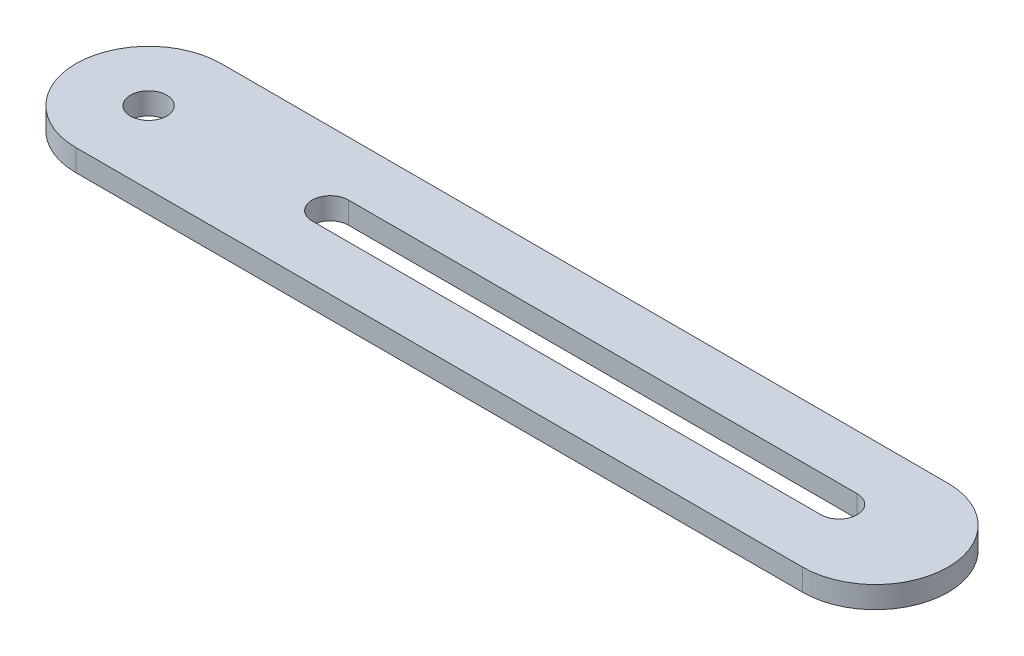
ISO-10303-21;
HEADER;
FILE_DESCRIPTION(('STEP AP214'),'2;1');
FILE_NAME('part.step','',(''),(''),'','','');
FILE_SCHEMA(('AUTOMOTIVE_DESIGN { 1 0 10303 214 1 1 1 1 }'));
ENDSEC;
DATA;
#1=APPLICATION_CONTEXT('core data for automotive mechanical design processes');
#2=APPLICATION_PROTOCOL_DEFINITION('international standard','automotive_design',2000,#1);
#3=PRODUCT_CONTEXT('',#1,'mechanical');
#4=PRODUCT('Part','Part','',(#3));
#5=PRODUCT_RELATED_PRODUCT_CATEGORY('part','',(#4));
#6=PRODUCT_DEFINITION_FORMATION('','',#4);
#7=PRODUCT_DEFINITION_CONTEXT('part definition',#1,'design');
#8=PRODUCT_DEFINITION('design','',#6,#7);
#9=PRODUCT_DEFINITION_SHAPE('','',#8);
#10=(LENGTH_UNIT() NAMED_UNIT(*) SI_UNIT(.MILLI.,.METRE.));
#11=(NAMED_UNIT(*) PLANE_ANGLE_UNIT() SI_UNIT($,.RADIAN.));
#12=(NAMED_UNIT(*) SI_UNIT($,.STERADIAN.) SOLID_ANGLE_UNIT());
#13=UNCERTAINTY_MEASURE_WITH_UNIT(LENGTH_MEASURE(1.E-05),#10,'distance_accuracy_value','');
#14=(GEOMETRIC_REPRESENTATION_CONTEXT(3) GLOBAL_UNCERTAINTY_ASSIGNED_CONTEXT((#13)) GLOBAL_UNIT_ASSIGNED_CONTEXT((#10,
#11,#12)) REPRESENTATION_CONTEXT('',''));
#15=CARTESIAN_POINT('',(0.,0.,0.));
#16=DIRECTION('',(0.,0.,1.));
#17=DIRECTION('',(1.,0.,0.));
#18=AXIS2_PLACEMENT_3D('',#15,#16,#17);
#19=CARTESIAN_POINT('',(-50.,-3.,0.));
#20=DIRECTION('',(0.,1.,0.));
#21=DIRECTION('',(0.,0.,1.));
#22=AXIS2_PLACEMENT_3D('',#19,#20,#21);
#23=CYLINDRICAL_SURFACE('',#22,10.);
#24=CARTESIAN_POINT('',(-50.,0.,0.));
#25=DIRECTION('',(0.,1.,0.));
#26=DIRECTION('',(0.,0.,1.));
#27=AXIS2_PLACEMENT_3D('',#24,#25,#26);
#28=CIRCLE('',#27,10.);
#29=CARTESIAN_POINT('',(-50.,0.,-10.));
#30=VERTEX_POINT('',#29);
#31=CARTESIAN_POINT('',(-50.,0.,10.));
#32=VERTEX_POINT('',#31);
#33=EDGE_CURVE('E138',#30,#32,#28,.T.);
#34=ORIENTED_EDGE('',*,*,#33,.F.);
#35=DIRECTION('',(0.,1.,0.));
#36=VECTOR('',#35,1.);
#37=CARTESIAN_POINT('',(-50.,-3.,-10.));
#38=LINE('',#37,#36);
#39=CARTESIAN_POINT('',(-50.,-3.,-10.));
#40=VERTEX_POINT('',#39);
#41=EDGE_CURVE('E11',#40,#30,#38,.T.);
#42=ORIENTED_EDGE('',*,*,#41,.F.);
#43=CARTESIAN_POINT('',(-50.,-3.,0.));
#44=DIRECTION('',(0.,1.,0.));
#45=DIRECTION('',(0.,0.,1.));
#46=AXIS2_PLACEMENT_3D('',#43,#44,#45);
#47=CIRCLE('',#46,10.);
#48=CARTESIAN_POINT('',(-50.,-3.,10.));
#49=VERTEX_POINT('',#48);
#50=EDGE_CURVE('E142',#40,#49,#47,.T.);
#51=ORIENTED_EDGE('',*,*,#50,.T.);
#52=DIRECTION('',(0.,1.,0.));
#53=VECTOR('',#52,1.);
#54=CARTESIAN_POINT('',(-50.,-3.,10.));
#55=LINE('',#54,#53);
#56=EDGE_CURVE('E39',#49,#32,#55,.T.);
#57=ORIENTED_EDGE('',*,*,#56,.T.);
#58=EDGE_LOOP('',(#34,#42,#51,#57));
#59=FACE_BOUND('',#58,.T.);
#60=ADVANCED_FACE('F36',(#59),#23,.T.);
#61=CARTESIAN_POINT('',(-50.,-3.,-10.));
#62=DIRECTION('',(0.,0.,-1.));
#63=DIRECTION('',(-1.,0.,0.));
#64=AXIS2_PLACEMENT_3D('',#61,#62,#63);
#65=PLANE('',#64);
#66=DIRECTION('',(-1.,0.,0.));
#67=VECTOR('',#66,1.);
#68=CARTESIAN_POINT('',(-50.,0.,-10.));
#69=LINE('',#68,#67);
#70=CARTESIAN_POINT('',(50.,0.,-10.));
#71=VERTEX_POINT('',#70);
#72=EDGE_CURVE('E146',#71,#30,#69,.T.);
#73=ORIENTED_EDGE('',*,*,#72,.F.);
#74=DIRECTION('',(0.,1.,0.));
#75=VECTOR('',#74,1.);
#76=CARTESIAN_POINT('',(50.,-3.,-10.));
#77=LINE('',#76,#75);
#78=CARTESIAN_POINT('',(50.,-3.,-10.));
#79=VERTEX_POINT('',#78);
#80=EDGE_CURVE('E44',#79,#71,#77,.T.);
#81=ORIENTED_EDGE('',*,*,#80,.F.);
#82=DIRECTION('',(-1.,0.,0.));
#83=VECTOR('',#82,1.);
#84=CARTESIAN_POINT('',(-50.,-3.,-10.));
#85=LINE('',#84,#83);
#86=EDGE_CURVE('E152',#79,#40,#85,.T.);
#87=ORIENTED_EDGE('',*,*,#86,.T.);
#88=ORIENTED_EDGE('',*,*,#41,.T.);
#89=EDGE_LOOP('',(#73,#81,#87,#88));
#90=FACE_BOUND('',#89,.T.);
#91=ADVANCED_FACE('F178',(#90),#65,.T.);
#92=CARTESIAN_POINT('',(50.,-3.,0.));
#93=DIRECTION('',(0.,1.,0.));
#94=DIRECTION('',(0.,0.,1.));
#95=AXIS2_PLACEMENT_3D('',#92,#93,#94);
#96=CYLINDRICAL_SURFACE('',#95,10.);
#97=CARTESIAN_POINT('',(50.,0.,0.));
#98=DIRECTION('',(0.,1.,0.));
#99=DIRECTION('',(0.,0.,1.));
#100=AXIS2_PLACEMENT_3D('',#97,#98,#99);
#101=CIRCLE('',#100,10.);
#102=CARTESIAN_POINT('',(50.,0.,10.));
#103=VERTEX_POINT('',#102);
#104=EDGE_CURVE('E160',#103,#71,#101,.T.);
#105=ORIENTED_EDGE('',*,*,#104,.F.);
#106=DIRECTION('',(0.,1.,0.));
#107=VECTOR('',#106,1.);
#108=CARTESIAN_POINT('',(50.,-3.,10.));
#109=LINE('',#108,#107);
#110=CARTESIAN_POINT('',(50.,-3.,10.));
#111=VERTEX_POINT('',#110);
#112=EDGE_CURVE('E165',#111,#103,#109,.T.);
#113=ORIENTED_EDGE('',*,*,#112,.F.);
#114=CARTESIAN_POINT('',(50.,-3.,0.));
#115=DIRECTION('',(0.,1.,0.));
#116=DIRECTION('',(0.,0.,1.));
#117=AXIS2_PLACEMENT_3D('',#114,#115,#116);
#118=CIRCLE('',#117,10.);
#119=EDGE_CURVE('E149',#111,#79,#118,.T.);
#120=ORIENTED_EDGE('',*,*,#119,.T.);
#121=ORIENTED_EDGE('',*,*,#80,.T.);
#122=EDGE_LOOP('',(#105,#113,#120,#121));
#123=FACE_BOUND('',#122,.T.);
#124=ADVANCED_FACE('F182',(#123),#96,.T.);
#125=CARTESIAN_POINT('',(-50.,-3.,10.));
#126=DIRECTION('',(0.,0.,1.));
#127=DIRECTION('',(1.,0.,0.));
#128=AXIS2_PLACEMENT_3D('',#125,#126,#127);
#129=PLANE('',#128);
#130=DIRECTION('',(1.,0.,0.));
#131=VECTOR('',#130,1.);
#132=CARTESIAN_POINT('',(-50.,0.,10.));
#133=LINE('',#132,#131);
#134=EDGE_CURVE('E157',#32,#103,#133,.T.);
#135=ORIENTED_EDGE('',*,*,#134,.F.);
#136=ORIENTED_EDGE('',*,*,#56,.F.);
#137=DIRECTION('',(1.,0.,0.));
#138=VECTOR('',#137,1.);
#139=CARTESIAN_POINT('',(-50.,-3.,10.));
#140=LINE('',#139,#138);
#141=EDGE_CURVE('E145',#49,#111,#140,.T.);
#142=ORIENTED_EDGE('',*,*,#141,.T.);
#143=ORIENTED_EDGE('',*,*,#112,.T.);
#144=EDGE_LOOP('',(#135,#136,#142,#143));
#145=FACE_BOUND('',#144,.T.);
#146=ADVANCED_FACE('F173',(#145),#129,.T.);
#147=CARTESIAN_POINT('',(-50.,-3.,0.));
#148=DIRECTION('',(0.,1.,0.));
#149=DIRECTION('',(0.,0.,1.));
#150=AXIS2_PLACEMENT_3D('',#147,#148,#149);
#151=PLANE('',#150);
#152=CARTESIAN_POINT('',(-50.,-3.,0.));
#153=DIRECTION('',(0.,1.,0.));
#154=DIRECTION('',(0.,0.,1.));
#155=AXIS2_PLACEMENT_3D('',#152,#153,#154);
#156=CIRCLE('',#155,2.5);
#157=CARTESIAN_POINT('',(-50.,-3.,2.5));
#158=VERTEX_POINT('',#157);
#159=EDGE_CURVE('E132',#158,#158,#156,.T.);
#160=ORIENTED_EDGE('',*,*,#159,.T.);
#161=EDGE_LOOP('',(#160));
#162=FACE_BOUND('',#161,.T.);
#163=DIRECTION('',(-1.,0.,0.));
#164=VECTOR('',#163,1.);
#165=CARTESIAN_POINT('',(-25.,-3.,-2.5));
#166=LINE('',#165,#164);
#167=CARTESIAN_POINT('',(45.,-3.,-2.50000000000001));
#168=VERTEX_POINT('',#167);
#169=CARTESIAN_POINT('',(-25.,-3.,-2.5));
#170=VERTEX_POINT('',#169);
#171=EDGE_CURVE('E109',#168,#170,#166,.T.);
#172=ORIENTED_EDGE('',*,*,#171,.T.);
#173=CARTESIAN_POINT('',(-25.,-3.,0.));
#174=DIRECTION('',(0.,1.,0.));
#175=DIRECTION('',(0.,0.,1.));
#176=AXIS2_PLACEMENT_3D('',#173,#174,#175);
#177=CIRCLE('',#176,2.5);
#178=CARTESIAN_POINT('',(-25.,-3.,2.5));
#179=VERTEX_POINT('',#178);
#180=EDGE_CURVE('E103',#170,#179,#177,.T.);
#181=ORIENTED_EDGE('',*,*,#180,.T.);
#182=DIRECTION('',(1.,0.,0.));
#183=VECTOR('',#182,1.);
#184=CARTESIAN_POINT('',(-25.,-3.,2.5));
#185=LINE('',#184,#183);
#186=CARTESIAN_POINT('',(45.,-3.,2.49999999999999));
#187=VERTEX_POINT('',#186);
#188=EDGE_CURVE('E112',#179,#187,#185,.T.);
#189=ORIENTED_EDGE('',*,*,#188,.T.);
#190=CARTESIAN_POINT('',(45.,-3.,0.));
#191=DIRECTION('',(0.,1.,0.));
#192=DIRECTION('',(0.,0.,1.));
#193=AXIS2_PLACEMENT_3D('',#190,#191,#192);
#194=CIRCLE('',#193,2.5);
#195=EDGE_CURVE('E52',#187,#168,#194,.T.);
#196=ORIENTED_EDGE('',*,*,#195,.T.);
#197=EDGE_LOOP('',(#172,#181,#189,#196));
#198=FACE_BOUND('',#197,.T.);
#199=ORIENTED_EDGE('',*,*,#50,.F.);
#200=ORIENTED_EDGE('',*,*,#86,.F.);
#201=ORIENTED_EDGE('',*,*,#119,.F.);
#202=ORIENTED_EDGE('',*,*,#141,.F.);
#203=EDGE_LOOP('',(#199,#200,#201,#202));
#204=FACE_BOUND('',#203,.T.);
#205=ADVANCED_FACE('F116',(#162,#198,#204),#151,.F.);
#206=CARTESIAN_POINT('',(-50.,0.,0.));
#207=DIRECTION('',(0.,1.,0.));
#208=DIRECTION('',(0.,0.,1.));
#209=AXIS2_PLACEMENT_3D('',#206,#207,#208);
#210=PLANE('',#209);
#211=CARTESIAN_POINT('',(-50.,0.,0.));
#212=DIRECTION('',(0.,1.,0.));
#213=DIRECTION('',(0.,0.,1.));
#214=AXIS2_PLACEMENT_3D('',#211,#212,#213);
#215=CIRCLE('',#214,2.5);
#216=CARTESIAN_POINT('',(-50.,0.,2.5));
#217=VERTEX_POINT('',#216);
#218=EDGE_CURVE('E125',#217,#217,#215,.T.);
#219=ORIENTED_EDGE('',*,*,#218,.F.);
#220=EDGE_LOOP('',(#219));
#221=FACE_BOUND('',#220,.T.);
#222=CARTESIAN_POINT('',(-25.,0.,0.));
#223=DIRECTION('',(0.,1.,0.));
#224=DIRECTION('',(0.,0.,1.));
#225=AXIS2_PLACEMENT_3D('',#222,#223,#224);
#226=CIRCLE('',#225,2.5);
#227=CARTESIAN_POINT('',(-25.,0.,-2.5));
#228=VERTEX_POINT('',#227);
#229=CARTESIAN_POINT('',(-25.,0.,2.5));
#230=VERTEX_POINT('',#229);
#231=EDGE_CURVE('E60',#228,#230,#226,.T.);
#232=ORIENTED_EDGE('',*,*,#231,.F.);
#233=DIRECTION('',(-1.,0.,0.));
#234=VECTOR('',#233,1.);
#235=CARTESIAN_POINT('',(-25.,0.,-2.5));
#236=LINE('',#235,#234);
#237=CARTESIAN_POINT('',(45.,0.,-2.50000000000001));
#238=VERTEX_POINT('',#237);
#239=EDGE_CURVE('E119',#238,#228,#236,.T.);
#240=ORIENTED_EDGE('',*,*,#239,.F.);
#241=CARTESIAN_POINT('',(45.,0.,0.));
#242=DIRECTION('',(0.,1.,0.));
#243=DIRECTION('',(0.,0.,1.));
#244=AXIS2_PLACEMENT_3D('',#241,#242,#243);
#245=CIRCLE('',#244,2.5);
#246=CARTESIAN_POINT('',(45.,0.,2.5));
#247=VERTEX_POINT('',#246);
#248=EDGE_CURVE('E122',#247,#238,#245,.T.);
#249=ORIENTED_EDGE('',*,*,#248,.F.);
#250=DIRECTION('',(1.,0.,0.));
#251=VECTOR('',#250,1.);
#252=CARTESIAN_POINT('',(-25.,0.,2.5));
#253=LINE('',#252,#251);
#254=EDGE_CURVE('E131',#230,#247,#253,.T.);
#255=ORIENTED_EDGE('',*,*,#254,.F.);
#256=EDGE_LOOP('',(#232,#240,#249,#255));
#257=FACE_BOUND('',#256,.T.);
#258=ORIENTED_EDGE('',*,*,#33,.T.);
#259=ORIENTED_EDGE('',*,*,#134,.T.);
#260=ORIENTED_EDGE('',*,*,#104,.T.);
#261=ORIENTED_EDGE('',*,*,#72,.T.);
#262=EDGE_LOOP('',(#258,#259,#260,#261));
#263=FACE_BOUND('',#262,.T.);
#264=ADVANCED_FACE('F175',(#221,#257,#263),#210,.T.);
#265=CARTESIAN_POINT('',(-25.,-3.,0.));
#266=DIRECTION('',(0.,1.,0.));
#267=DIRECTION('',(0.,0.,1.));
#268=AXIS2_PLACEMENT_3D('',#265,#266,#267);
#269=CYLINDRICAL_SURFACE('',#268,2.5);
#270=ORIENTED_EDGE('',*,*,#231,.T.);
#271=DIRECTION('',(0.,1.,0.));
#272=VECTOR('',#271,1.);
#273=CARTESIAN_POINT('',(-25.,-3.,2.5));
#274=LINE('',#273,#272);
#275=EDGE_CURVE('E99',#179,#230,#274,.T.);
#276=ORIENTED_EDGE('',*,*,#275,.F.);
#277=ORIENTED_EDGE('',*,*,#180,.F.);
#278=DIRECTION('',(0.,1.,0.));
#279=VECTOR('',#278,1.);
#280=CARTESIAN_POINT('',(-25.,-3.,-2.5));
#281=LINE('',#280,#279);
#282=EDGE_CURVE('E136',#170,#228,#281,.T.);
#283=ORIENTED_EDGE('',*,*,#282,.T.);
#284=EDGE_LOOP('',(#270,#276,#277,#283));
#285=FACE_BOUND('',#284,.T.);
#286=ADVANCED_FACE('F101',(#285),#269,.F.);
#287=CARTESIAN_POINT('',(-25.,-3.,-2.5));
#288=DIRECTION('',(0.,0.,-1.));
#289=DIRECTION('',(-1.,0.,0.));
#290=AXIS2_PLACEMENT_3D('',#287,#288,#289);
#291=PLANE('',#290);
#292=ORIENTED_EDGE('',*,*,#239,.T.);
#293=ORIENTED_EDGE('',*,*,#282,.F.);
#294=ORIENTED_EDGE('',*,*,#171,.F.);
#295=DIRECTION('',(0.,1.,0.));
#296=VECTOR('',#295,1.);
#297=CARTESIAN_POINT('',(45.,-3.,-2.50000000000001));
#298=LINE('',#297,#296);
#299=EDGE_CURVE('E139',#168,#238,#298,.T.);
#300=ORIENTED_EDGE('',*,*,#299,.T.);
#301=EDGE_LOOP('',(#292,#293,#294,#300));
#302=FACE_BOUND('',#301,.T.);
#303=ADVANCED_FACE('F239',(#302),#291,.F.);
#304=CARTESIAN_POINT('',(45.,-3.,0.));
#305=DIRECTION('',(0.,1.,0.));
#306=DIRECTION('',(0.,0.,1.));
#307=AXIS2_PLACEMENT_3D('',#304,#305,#306);
#308=CYLINDRICAL_SURFACE('',#307,2.5);
#309=ORIENTED_EDGE('',*,*,#248,.T.);
#310=ORIENTED_EDGE('',*,*,#299,.F.);
#311=ORIENTED_EDGE('',*,*,#195,.F.);
#312=DIRECTION('',(0.,1.,0.));
#313=VECTOR('',#312,1.);
#314=CARTESIAN_POINT('',(45.,-3.,2.5));
#315=LINE('',#314,#313);
#316=EDGE_CURVE('E108',#187,#247,#315,.T.);
#317=ORIENTED_EDGE('',*,*,#316,.T.);
#318=EDGE_LOOP('',(#309,#310,#311,#317));
#319=FACE_BOUND('',#318,.T.);
#320=ADVANCED_FACE('F249',(#319),#308,.F.);
#321=CARTESIAN_POINT('',(-25.,-3.,2.5));
#322=DIRECTION('',(0.,0.,1.));
#323=DIRECTION('',(1.,0.,0.));
#324=AXIS2_PLACEMENT_3D('',#321,#322,#323);
#325=PLANE('',#324);
#326=ORIENTED_EDGE('',*,*,#254,.T.);
#327=ORIENTED_EDGE('',*,*,#316,.F.);
#328=ORIENTED_EDGE('',*,*,#188,.F.);
#329=ORIENTED_EDGE('',*,*,#275,.T.);
#330=EDGE_LOOP('',(#326,#327,#328,#329));
#331=FACE_BOUND('',#330,.T.);
#332=ADVANCED_FACE('F113',(#331),#325,.F.);
#333=CARTESIAN_POINT('',(-50.,-3.,0.));
#334=DIRECTION('',(0.,1.,0.));
#335=DIRECTION('',(0.,0.,1.));
#336=AXIS2_PLACEMENT_3D('',#333,#334,#335);
#337=CYLINDRICAL_SURFACE('',#336,2.5);
#338=ORIENTED_EDGE('',*,*,#159,.F.);
#339=EDGE_LOOP('',(#338));
#340=FACE_BOUND('',#339,.T.);
#341=ORIENTED_EDGE('',*,*,#218,.T.);
#342=EDGE_LOOP('',(#341));
#343=FACE_BOUND('',#342,.T.);
#344=ADVANCED_FACE('F269',(#340,#343),#337,.F.);
#345=CLOSED_SHELL('',(#60,#91,#124,#146,#205,#264,#286,#303,#320,#332,#344));
#346=MANIFOLD_SOLID_BREP('B2',#345);
#347=ADVANCED_BREP_SHAPE_REPRESENTATION('',(#18,#346),#14);
#348=SHAPE_DEFINITION_REPRESENTATION(#9,#347);
ENDSEC;
END-ISO-10303-21;
